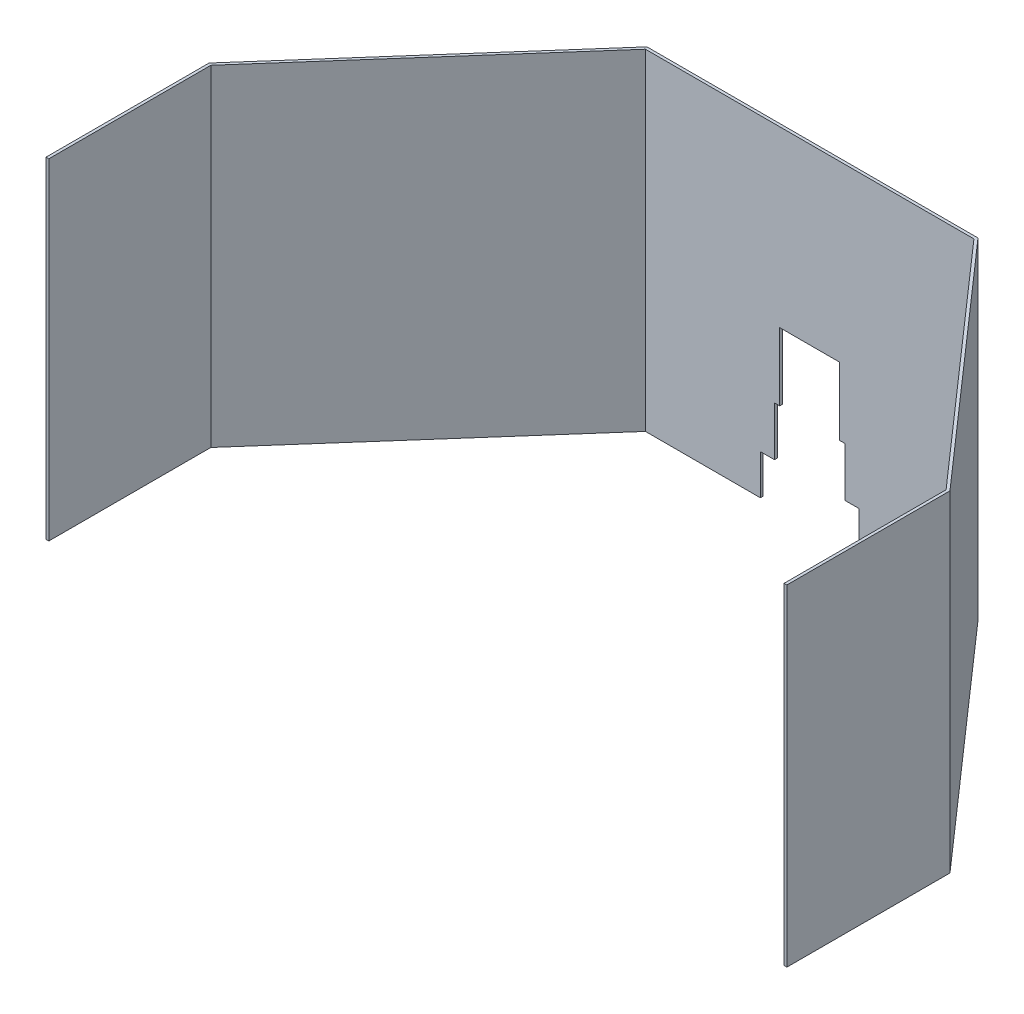
ISO-10303-21;
HEADER;
FILE_DESCRIPTION(('STEP AP214'),'2;1');
FILE_NAME('part.step','',(''),(''),'','','');
FILE_SCHEMA(('AUTOMOTIVE_DESIGN { 1 0 10303 214 1 1 1 1 }'));
ENDSEC;
DATA;
#1=APPLICATION_CONTEXT('core data for automotive mechanical design processes');
#2=APPLICATION_PROTOCOL_DEFINITION('international standard','automotive_design',2000,#1);
#3=PRODUCT_CONTEXT('',#1,'mechanical');
#4=PRODUCT('Part','Part','',(#3));
#5=PRODUCT_RELATED_PRODUCT_CATEGORY('part','',(#4));
#6=PRODUCT_DEFINITION_FORMATION('','',#4);
#7=PRODUCT_DEFINITION_CONTEXT('part definition',#1,'design');
#8=PRODUCT_DEFINITION('design','',#6,#7);
#9=PRODUCT_DEFINITION_SHAPE('','',#8);
#10=(LENGTH_UNIT() NAMED_UNIT(*) SI_UNIT(.MILLI.,.METRE.));
#11=(NAMED_UNIT(*) PLANE_ANGLE_UNIT() SI_UNIT($,.RADIAN.));
#12=(NAMED_UNIT(*) SI_UNIT($,.STERADIAN.) SOLID_ANGLE_UNIT());
#13=UNCERTAINTY_MEASURE_WITH_UNIT(LENGTH_MEASURE(1.E-05),#10,'distance_accuracy_value','');
#14=(GEOMETRIC_REPRESENTATION_CONTEXT(3) GLOBAL_UNCERTAINTY_ASSIGNED_CONTEXT((#13)) GLOBAL_UNIT_ASSIGNED_CONTEXT((#10,
#11,#12)) REPRESENTATION_CONTEXT('',''));
#15=CARTESIAN_POINT('',(0.,0.,0.));
#16=DIRECTION('',(0.,0.,1.));
#17=DIRECTION('',(1.,0.,0.));
#18=AXIS2_PLACEMENT_3D('',#15,#16,#17);
#19=CARTESIAN_POINT('',(0.,0.,0.));
#20=DIRECTION('',(0.,-1.,0.));
#21=DIRECTION('',(0.,0.,-1.));
#22=AXIS2_PLACEMENT_3D('',#19,#20,#21);
#23=PLANE('',#22);
#24=DIRECTION('',(1.,0.,0.));
#25=VECTOR('',#24,1.);
#26=CARTESIAN_POINT('',(-117.504462868261,0.,-326.155640462222));
#27=LINE('',#26,#25);
#28=CARTESIAN_POINT('',(-117.504462868261,0.,-326.155640462222));
#29=VERTEX_POINT('',#28);
#30=CARTESIAN_POINT('',(-35.0000000000001,0.,-326.155640462222));
#31=VERTEX_POINT('',#30);
#32=EDGE_CURVE('E179',#29,#31,#27,.T.);
#33=ORIENTED_EDGE('',*,*,#32,.T.);
#34=DIRECTION('',(0.,0.,-1.));
#35=VECTOR('',#34,1.);
#36=CARTESIAN_POINT('',(-35.,0.,-192.503637066453));
#37=LINE('',#36,#35);
#38=CARTESIAN_POINT('',(-35.0000000000001,0.,-324.155640398222));
#39=VERTEX_POINT('',#38);
#40=EDGE_CURVE('E261',#39,#31,#37,.T.);
#41=ORIENTED_EDGE('',*,*,#40,.F.);
#42=DIRECTION('',(1.,0.,0.));
#43=VECTOR('',#42,1.);
#44=CARTESIAN_POINT('',(-116.600094821892,0.,-324.155640398222));
#45=LINE('',#44,#43);
#46=CARTESIAN_POINT('',(-116.600094821892,0.,-324.155640398222));
#47=VERTEX_POINT('',#46);
#48=EDGE_CURVE('E192',#47,#39,#45,.T.);
#49=ORIENTED_EDGE('',*,*,#48,.F.);
#50=DIRECTION('',(-0.660480799666582,0.,0.750842935154745));
#51=VECTOR('',#50,1.);
#52=CARTESIAN_POINT('',(-116.600094821892,0.,-324.155640398222));
#53=LINE('',#52,#51);
#54=CARTESIAN_POINT('',(-261.,0.,-159.999999999999));
#55=VERTEX_POINT('',#54);
#56=EDGE_CURVE('E190',#47,#55,#53,.T.);
#57=ORIENTED_EDGE('',*,*,#56,.T.);
#58=DIRECTION('',(0.,0.,1.));
#59=VECTOR('',#58,1.);
#60=CARTESIAN_POINT('',(-261.,0.,-159.999999999999));
#61=LINE('',#60,#59);
#62=CARTESIAN_POINT('',(-261.,0.,-45.0012142751788));
#63=VERTEX_POINT('',#62);
#64=EDGE_CURVE('E145',#55,#63,#61,.T.);
#65=ORIENTED_EDGE('',*,*,#64,.T.);
#66=DIRECTION('',(1.,0.,9.02056178642204E-13));
#67=VECTOR('',#66,1.);
#68=CARTESIAN_POINT('',(-263.000000064,0.,-45.0012142751806));
#69=LINE('',#68,#67);
#70=CARTESIAN_POINT('',(-263.000000064,0.,-45.0012142751806));
#71=VERTEX_POINT('',#70);
#72=EDGE_CURVE('E186',#71,#63,#69,.T.);
#73=ORIENTED_EDGE('',*,*,#72,.F.);
#74=DIRECTION('',(0.,0.,1.));
#75=VECTOR('',#74,1.);
#76=CARTESIAN_POINT('',(-263.000000064,0.,-160.75447171498));
#77=LINE('',#76,#75);
#78=CARTESIAN_POINT('',(-263.000000064,0.,-160.75447171498));
#79=VERTEX_POINT('',#78);
#80=EDGE_CURVE('E184',#79,#71,#77,.T.);
#81=ORIENTED_EDGE('',*,*,#80,.F.);
#82=DIRECTION('',(-0.660480799666582,0.,0.750842935154745));
#83=VECTOR('',#82,1.);
#84=CARTESIAN_POINT('',(-117.504462868261,0.,-326.155640462222));
#85=LINE('',#84,#83);
#86=EDGE_CURVE('E182',#29,#79,#85,.T.);
#87=ORIENTED_EDGE('',*,*,#86,.F.);
#88=EDGE_LOOP('',(#33,#41,#49,#57,#65,#73,#81,#87));
#89=FACE_BOUND('',#88,.T.);
#90=ADVANCED_FACE('F33',(#89),#23,.T.);
#91=CARTESIAN_POINT('',(116.600094821898,234.9999999,-324.155640398222));
#92=DIRECTION('',(0.750842935154446,0.,-0.660480799666921));
#93=DIRECTION('',(-0.660480799666921,0.,-0.750842935154446));
#94=AXIS2_PLACEMENT_3D('',#91,#92,#93);
#95=PLANE('',#94);
#96=DIRECTION('',(0.660480799666921,0.,0.750842935154446));
#97=VECTOR('',#96,1.);
#98=CARTESIAN_POINT('',(116.600094821898,0.,-324.155640398222));
#99=LINE('',#98,#97);
#100=CARTESIAN_POINT('',(116.600094821898,0.,-324.155640398222));
#101=VERTEX_POINT('',#100);
#102=CARTESIAN_POINT('',(261.,0.,-160.000000000156));
#103=VERTEX_POINT('',#102);
#104=EDGE_CURVE('E165',#101,#103,#99,.T.);
#105=ORIENTED_EDGE('',*,*,#104,.T.);
#106=DIRECTION('',(0.,-1.,0.));
#107=VECTOR('',#106,1.);
#108=CARTESIAN_POINT('',(261.,234.9999999,-160.000000000156));
#109=LINE('',#108,#107);
#110=CARTESIAN_POINT('',(261.,234.9999999,-160.000000000156));
#111=VERTEX_POINT('',#110);
#112=EDGE_CURVE('E11',#111,#103,#109,.T.);
#113=ORIENTED_EDGE('',*,*,#112,.F.);
#114=DIRECTION('',(0.660480799666921,0.,0.750842935154446));
#115=VECTOR('',#114,1.);
#116=CARTESIAN_POINT('',(116.600094821898,234.9999999,-324.155640398222));
#117=LINE('',#116,#115);
#118=CARTESIAN_POINT('',(116.600094821898,234.9999999,-324.155640398222));
#119=VERTEX_POINT('',#118);
#120=EDGE_CURVE('E195',#119,#111,#117,.T.);
#121=ORIENTED_EDGE('',*,*,#120,.F.);
#122=DIRECTION('',(0.,-1.,0.));
#123=VECTOR('',#122,1.);
#124=CARTESIAN_POINT('',(116.600094821898,234.9999999,-324.155640398222));
#125=LINE('',#124,#123);
#126=EDGE_CURVE('E161',#119,#101,#125,.T.);
#127=ORIENTED_EDGE('',*,*,#126,.T.);
#128=EDGE_LOOP('',(#105,#113,#121,#127));
#129=FACE_BOUND('',#128,.T.);
#130=ADVANCED_FACE('F35',(#129),#95,.F.);
#131=CARTESIAN_POINT('',(261.,234.9999999,-160.000000000156));
#132=DIRECTION('',(1.,0.,0.));
#133=DIRECTION('',(0.,0.,-1.));
#134=AXIS2_PLACEMENT_3D('',#131,#132,#133);
#135=PLANE('',#134);
#136=DIRECTION('',(0.,0.,1.));
#137=VECTOR('',#136,1.);
#138=CARTESIAN_POINT('',(261.,0.,-160.000000000156));
#139=LINE('',#138,#137);
#140=CARTESIAN_POINT('',(261.,0.,-45.0034531183566));
#141=VERTEX_POINT('',#140);
#142=EDGE_CURVE('E168',#103,#141,#139,.T.);
#143=ORIENTED_EDGE('',*,*,#142,.T.);
#144=DIRECTION('',(0.,-1.,0.));
#145=VECTOR('',#144,1.);
#146=CARTESIAN_POINT('',(261.,234.9999999,-45.0034531183566));
#147=LINE('',#146,#145);
#148=CARTESIAN_POINT('',(261.,234.9999999,-45.0034531183566));
#149=VERTEX_POINT('',#148);
#150=EDGE_CURVE('E41',#149,#141,#147,.T.);
#151=ORIENTED_EDGE('',*,*,#150,.F.);
#152=DIRECTION('',(0.,0.,1.));
#153=VECTOR('',#152,1.);
#154=CARTESIAN_POINT('',(261.,234.9999999,-160.000000000156));
#155=LINE('',#154,#153);
#156=EDGE_CURVE('E111',#111,#149,#155,.T.);
#157=ORIENTED_EDGE('',*,*,#156,.F.);
#158=ORIENTED_EDGE('',*,*,#112,.T.);
#159=EDGE_LOOP('',(#143,#151,#157,#158));
#160=FACE_BOUND('',#159,.T.);
#161=ADVANCED_FACE('F477',(#160),#135,.F.);
#162=CARTESIAN_POINT('',(261.,234.9999999,-45.0034531183566));
#163=DIRECTION('',(0.,0.,-1.));
#164=DIRECTION('',(-1.,0.,0.));
#165=AXIS2_PLACEMENT_3D('',#162,#163,#164);
#166=PLANE('',#165);
#167=DIRECTION('',(1.,0.,0.));
#168=VECTOR('',#167,1.);
#169=CARTESIAN_POINT('',(261.,0.,-45.0034531183566));
#170=LINE('',#169,#168);
#171=CARTESIAN_POINT('',(263.000000064,0.,-45.0034531183566));
#172=VERTEX_POINT('',#171);
#173=EDGE_CURVE('E171',#141,#172,#170,.T.);
#174=ORIENTED_EDGE('',*,*,#173,.T.);
#175=DIRECTION('',(0.,-1.,0.));
#176=VECTOR('',#175,1.);
#177=CARTESIAN_POINT('',(263.000000064,234.9999999,-45.0034531183566));
#178=LINE('',#177,#176);
#179=CARTESIAN_POINT('',(263.000000064,234.9999999,-45.0034531183566));
#180=VERTEX_POINT('',#179);
#181=EDGE_CURVE('E213',#180,#172,#178,.T.);
#182=ORIENTED_EDGE('',*,*,#181,.F.);
#183=DIRECTION('',(1.,0.,0.));
#184=VECTOR('',#183,1.);
#185=CARTESIAN_POINT('',(261.,234.9999999,-45.0034531183566));
#186=LINE('',#185,#184);
#187=EDGE_CURVE('E221',#149,#180,#186,.T.);
#188=ORIENTED_EDGE('',*,*,#187,.F.);
#189=ORIENTED_EDGE('',*,*,#150,.T.);
#190=EDGE_LOOP('',(#174,#182,#188,#189));
#191=FACE_BOUND('',#190,.T.);
#192=ADVANCED_FACE('F219',(#191),#166,.F.);
#193=CARTESIAN_POINT('',(263.000000064,234.9999999,-45.0034531183566));
#194=DIRECTION('',(-1.,0.,0.));
#195=DIRECTION('',(0.,0.,1.));
#196=AXIS2_PLACEMENT_3D('',#193,#194,#195);
#197=PLANE('',#196);
#198=DIRECTION('',(0.,0.,-1.));
#199=VECTOR('',#198,1.);
#200=CARTESIAN_POINT('',(263.000000064,0.,-45.0034531183566));
#201=LINE('',#200,#199);
#202=CARTESIAN_POINT('',(263.000000064,0.,-160.754471714977));
#203=VERTEX_POINT('',#202);
#204=EDGE_CURVE('E173',#172,#203,#201,.T.);
#205=ORIENTED_EDGE('',*,*,#204,.T.);
#206=DIRECTION('',(0.,-1.,0.));
#207=VECTOR('',#206,1.);
#208=CARTESIAN_POINT('',(263.000000064,234.9999999,-160.754471714977));
#209=LINE('',#208,#207);
#210=CARTESIAN_POINT('',(263.000000064,234.9999999,-160.754471714977));
#211=VERTEX_POINT('',#210);
#212=EDGE_CURVE('E210',#211,#203,#209,.T.);
#213=ORIENTED_EDGE('',*,*,#212,.F.);
#214=DIRECTION('',(0.,0.,-1.));
#215=VECTOR('',#214,1.);
#216=CARTESIAN_POINT('',(263.000000064,234.9999999,-45.0034531183566));
#217=LINE('',#216,#215);
#218=EDGE_CURVE('E240',#180,#211,#217,.T.);
#219=ORIENTED_EDGE('',*,*,#218,.F.);
#220=ORIENTED_EDGE('',*,*,#181,.T.);
#221=EDGE_LOOP('',(#205,#213,#219,#220));
#222=FACE_BOUND('',#221,.T.);
#223=ADVANCED_FACE('F230',(#222),#197,.F.);
#224=CARTESIAN_POINT('',(263.000000064,234.9999999,-160.754471714977));
#225=DIRECTION('',(-0.750842935154767,0.,0.660480799666557));
#226=DIRECTION('',(0.660480799666557,0.,0.750842935154767));
#227=AXIS2_PLACEMENT_3D('',#224,#225,#226);
#228=PLANE('',#227);
#229=DIRECTION('',(-0.660480799666557,0.,-0.750842935154767));
#230=VECTOR('',#229,1.);
#231=CARTESIAN_POINT('',(263.000000064,0.,-160.754471714977));
#232=LINE('',#231,#230);
#233=CARTESIAN_POINT('',(117.504462868267,0.,-326.155640462222));
#234=VERTEX_POINT('',#233);
#235=EDGE_CURVE('E175',#203,#234,#232,.T.);
#236=ORIENTED_EDGE('',*,*,#235,.T.);
#237=DIRECTION('',(0.,-1.,0.));
#238=VECTOR('',#237,1.);
#239=CARTESIAN_POINT('',(117.504462868267,234.9999999,-326.155640462222));
#240=LINE('',#239,#238);
#241=CARTESIAN_POINT('',(117.504462868267,234.9999999,-326.155640462222));
#242=VERTEX_POINT('',#241);
#243=EDGE_CURVE('E207',#242,#234,#240,.T.);
#244=ORIENTED_EDGE('',*,*,#243,.F.);
#245=DIRECTION('',(-0.660480799666557,0.,-0.750842935154767));
#246=VECTOR('',#245,1.);
#247=CARTESIAN_POINT('',(263.000000064,234.9999999,-160.754471714977));
#248=LINE('',#247,#246);
#249=EDGE_CURVE('E236',#211,#242,#248,.T.);
#250=ORIENTED_EDGE('',*,*,#249,.F.);
#251=ORIENTED_EDGE('',*,*,#212,.T.);
#252=EDGE_LOOP('',(#236,#244,#250,#251));
#253=FACE_BOUND('',#252,.T.);
#254=ADVANCED_FACE('F234',(#253),#228,.F.);
#255=CARTESIAN_POINT('',(-117.504462868261,234.9999999,-326.155640462222));
#256=DIRECTION('',(0.,0.,-1.));
#257=DIRECTION('',(-1.,0.,0.));
#258=AXIS2_PLACEMENT_3D('',#255,#256,#257);
#259=PLANE('',#258);
#260=DIRECTION('',(0.,-1.,0.));
#261=VECTOR('',#260,1.);
#262=CARTESIAN_POINT('',(35.,0.,-326.155640462222));
#263=LINE('',#262,#261);
#264=CARTESIAN_POINT('',(35.,28.4,-326.155640462222));
#265=VERTEX_POINT('',#264);
#266=CARTESIAN_POINT('',(35.,0.,-326.155640462222));
#267=VERTEX_POINT('',#266);
#268=EDGE_CURVE('E317',#265,#267,#263,.T.);
#269=ORIENTED_EDGE('',*,*,#268,.F.);
#270=DIRECTION('',(-1.,0.,0.));
#271=VECTOR('',#270,1.);
#272=CARTESIAN_POINT('',(0.,28.4,-326.155640462222));
#273=LINE('',#272,#271);
#274=CARTESIAN_POINT('',(24.9999999999999,28.4,-326.155640462222));
#275=VERTEX_POINT('',#274);
#276=EDGE_CURVE('E320',#265,#275,#273,.T.);
#277=ORIENTED_EDGE('',*,*,#276,.T.);
#278=DIRECTION('',(0.,-1.,0.));
#279=VECTOR('',#278,1.);
#280=CARTESIAN_POINT('',(24.9999999999999,0.,-326.155640462222));
#281=LINE('',#280,#279);
#282=CARTESIAN_POINT('',(24.9999999999999,63.399999946,-326.155640462222));
#283=VERTEX_POINT('',#282);
#284=EDGE_CURVE('E323',#283,#275,#281,.T.);
#285=ORIENTED_EDGE('',*,*,#284,.F.);
#286=DIRECTION('',(-1.,0.,0.));
#287=VECTOR('',#286,1.);
#288=CARTESIAN_POINT('',(0.,63.399999946,-326.155640462222));
#289=LINE('',#288,#287);
#290=CARTESIAN_POINT('',(21.2499999999999,63.399999946,-326.155640462222));
#291=VERTEX_POINT('',#290);
#292=EDGE_CURVE('E326',#283,#291,#289,.T.);
#293=ORIENTED_EDGE('',*,*,#292,.T.);
#294=DIRECTION('',(0.,-1.,0.));
#295=VECTOR('',#294,1.);
#296=CARTESIAN_POINT('',(21.2499999999999,0.,-326.155640462222));
#297=LINE('',#296,#295);
#298=CARTESIAN_POINT('',(21.2499999999999,111.499999916,-326.155640462222));
#299=VERTEX_POINT('',#298);
#300=EDGE_CURVE('E329',#299,#291,#297,.T.);
#301=ORIENTED_EDGE('',*,*,#300,.F.);
#302=DIRECTION('',(-1.,0.,0.));
#303=VECTOR('',#302,1.);
#304=CARTESIAN_POINT('',(-1.0640890797438E-13,111.499999916,-326.155640462222));
#305=LINE('',#304,#303);
#306=CARTESIAN_POINT('',(-21.2500000000001,111.499999916,-326.155640462222));
#307=VERTEX_POINT('',#306);
#308=EDGE_CURVE('E332',#299,#307,#305,.T.);
#309=ORIENTED_EDGE('',*,*,#308,.T.);
#310=DIRECTION('',(0.,-1.,0.));
#311=VECTOR('',#310,1.);
#312=CARTESIAN_POINT('',(-21.2500000000001,0.,-326.155640462222));
#313=LINE('',#312,#311);
#314=CARTESIAN_POINT('',(-21.2500000000001,63.399999946,-326.155640462222));
#315=VERTEX_POINT('',#314);
#316=EDGE_CURVE('E335',#307,#315,#313,.T.);
#317=ORIENTED_EDGE('',*,*,#316,.T.);
#318=CARTESIAN_POINT('',(-25.0000000000001,63.399999946,-326.155640462222));
#319=VERTEX_POINT('',#318);
#320=EDGE_CURVE('E281',#315,#319,#289,.T.);
#321=ORIENTED_EDGE('',*,*,#320,.T.);
#322=DIRECTION('',(0.,-1.,0.));
#323=VECTOR('',#322,1.);
#324=CARTESIAN_POINT('',(-25.0000000000001,0.,-326.155640462222));
#325=LINE('',#324,#323);
#326=CARTESIAN_POINT('',(-25.0000000000001,28.4,-326.155640462222));
#327=VERTEX_POINT('',#326);
#328=EDGE_CURVE('E310',#319,#327,#325,.T.);
#329=ORIENTED_EDGE('',*,*,#328,.T.);
#330=CARTESIAN_POINT('',(-35.,28.4,-326.155640462222));
#331=VERTEX_POINT('',#330);
#332=EDGE_CURVE('E313',#327,#331,#273,.T.);
#333=ORIENTED_EDGE('',*,*,#332,.T.);
#334=DIRECTION('',(0.,-1.,0.));
#335=VECTOR('',#334,1.);
#336=CARTESIAN_POINT('',(-35.0000000000001,0.,-326.155640462222));
#337=LINE('',#336,#335);
#338=EDGE_CURVE('E314',#331,#31,#337,.T.);
#339=ORIENTED_EDGE('',*,*,#338,.T.);
#340=ORIENTED_EDGE('',*,*,#32,.F.);
#341=DIRECTION('',(0.,-1.,0.));
#342=VECTOR('',#341,1.);
#343=CARTESIAN_POINT('',(-117.504462868261,234.9999999,-326.155640462222));
#344=LINE('',#343,#342);
#345=CARTESIAN_POINT('',(-117.504462868261,234.9999999,-326.155640462222));
#346=VERTEX_POINT('',#345);
#347=EDGE_CURVE('E205',#346,#29,#344,.T.);
#348=ORIENTED_EDGE('',*,*,#347,.F.);
#349=DIRECTION('',(1.,0.,0.));
#350=VECTOR('',#349,1.);
#351=CARTESIAN_POINT('',(-117.504462868261,234.9999999,-326.155640462222));
#352=LINE('',#351,#350);
#353=EDGE_CURVE('E239',#346,#242,#352,.T.);
#354=ORIENTED_EDGE('',*,*,#353,.T.);
#355=ORIENTED_EDGE('',*,*,#243,.T.);
#356=EDGE_CURVE('E178',#267,#234,#27,.T.);
#357=ORIENTED_EDGE('',*,*,#356,.F.);
#358=EDGE_LOOP('',(#269,#277,#285,#293,#301,#309,#317,#321,#329,#333,#339,#340,#348,#354,#355,#357));
#359=FACE_BOUND('',#358,.T.);
#360=ADVANCED_FACE('F397',(#359),#259,.T.);
#361=CARTESIAN_POINT('',(-117.504462868261,234.9999999,-326.155640462222));
#362=DIRECTION('',(0.750842935154745,0.,0.660480799666582));
#363=DIRECTION('',(0.660480799666582,0.,-0.750842935154745));
#364=AXIS2_PLACEMENT_3D('',#361,#362,#363);
#365=PLANE('',#364);
#366=ORIENTED_EDGE('',*,*,#86,.T.);
#367=DIRECTION('',(0.,-1.,0.));
#368=VECTOR('',#367,1.);
#369=CARTESIAN_POINT('',(-263.000000064,234.9999999,-160.75447171498));
#370=LINE('',#369,#368);
#371=CARTESIAN_POINT('',(-263.000000064,234.9999999,-160.75447171498));
#372=VERTEX_POINT('',#371);
#373=EDGE_CURVE('E202',#372,#79,#370,.T.);
#374=ORIENTED_EDGE('',*,*,#373,.F.);
#375=DIRECTION('',(-0.660480799666582,0.,0.750842935154745));
#376=VECTOR('',#375,1.);
#377=CARTESIAN_POINT('',(-117.504462868261,234.9999999,-326.155640462222));
#378=LINE('',#377,#376);
#379=EDGE_CURVE('E242',#346,#372,#378,.T.);
#380=ORIENTED_EDGE('',*,*,#379,.F.);
#381=ORIENTED_EDGE('',*,*,#347,.T.);
#382=EDGE_LOOP('',(#366,#374,#380,#381));
#383=FACE_BOUND('',#382,.T.);
#384=ADVANCED_FACE('F445',(#383),#365,.F.);
#385=CARTESIAN_POINT('',(-263.000000064,234.9999999,-160.75447171498));
#386=DIRECTION('',(1.,0.,0.));
#387=DIRECTION('',(0.,0.,-1.));
#388=AXIS2_PLACEMENT_3D('',#385,#386,#387);
#389=PLANE('',#388);
#390=ORIENTED_EDGE('',*,*,#80,.T.);
#391=DIRECTION('',(0.,-1.,0.));
#392=VECTOR('',#391,1.);
#393=CARTESIAN_POINT('',(-263.000000064,234.9999999,-45.0012142751806));
#394=LINE('',#393,#392);
#395=CARTESIAN_POINT('',(-263.000000064,234.9999999,-45.0012142751806));
#396=VERTEX_POINT('',#395);
#397=EDGE_CURVE('E199',#396,#71,#394,.T.);
#398=ORIENTED_EDGE('',*,*,#397,.F.);
#399=DIRECTION('',(0.,0.,1.));
#400=VECTOR('',#399,1.);
#401=CARTESIAN_POINT('',(-263.000000064,234.9999999,-160.75447171498));
#402=LINE('',#401,#400);
#403=EDGE_CURVE('E248',#372,#396,#402,.T.);
#404=ORIENTED_EDGE('',*,*,#403,.F.);
#405=ORIENTED_EDGE('',*,*,#373,.T.);
#406=EDGE_LOOP('',(#390,#398,#404,#405));
#407=FACE_BOUND('',#406,.T.);
#408=ADVANCED_FACE('F254',(#407),#389,.F.);
#409=CARTESIAN_POINT('',(-263.000000064,234.9999999,-45.0012142751806));
#410=DIRECTION('',(9.02056178642204E-13,0.,-1.));
#411=DIRECTION('',(-1.,0.,-9.02056178642204E-13));
#412=AXIS2_PLACEMENT_3D('',#409,#410,#411);
#413=PLANE('',#412);
#414=ORIENTED_EDGE('',*,*,#72,.T.);
#415=DIRECTION('',(0.,-1.,0.));
#416=VECTOR('',#415,1.);
#417=CARTESIAN_POINT('',(-261.,234.9999999,-45.0012142751788));
#418=LINE('',#417,#416);
#419=CARTESIAN_POINT('',(-261.,234.9999999,-45.0012142751788));
#420=VERTEX_POINT('',#419);
#421=EDGE_CURVE('E150',#420,#63,#418,.T.);
#422=ORIENTED_EDGE('',*,*,#421,.F.);
#423=DIRECTION('',(1.,0.,9.02056178642204E-13));
#424=VECTOR('',#423,1.);
#425=CARTESIAN_POINT('',(-263.000000064,234.9999999,-45.0012142751806));
#426=LINE('',#425,#424);
#427=EDGE_CURVE('E156',#396,#420,#426,.T.);
#428=ORIENTED_EDGE('',*,*,#427,.F.);
#429=ORIENTED_EDGE('',*,*,#397,.T.);
#430=EDGE_LOOP('',(#414,#422,#428,#429));
#431=FACE_BOUND('',#430,.T.);
#432=ADVANCED_FACE('F258',(#431),#413,.F.);
#433=CARTESIAN_POINT('',(-261.,234.9999999,-159.999999999999));
#434=DIRECTION('',(1.,0.,0.));
#435=DIRECTION('',(0.,0.,-1.));
#436=AXIS2_PLACEMENT_3D('',#433,#434,#435);
#437=PLANE('',#436);
#438=ORIENTED_EDGE('',*,*,#64,.F.);
#439=DIRECTION('',(0.,-1.,0.));
#440=VECTOR('',#439,1.);
#441=CARTESIAN_POINT('',(-261.,234.9999999,-159.999999999999));
#442=LINE('',#441,#440);
#443=CARTESIAN_POINT('',(-261.,234.9999999,-159.999999999999));
#444=VERTEX_POINT('',#443);
#445=EDGE_CURVE('E140',#444,#55,#442,.T.);
#446=ORIENTED_EDGE('',*,*,#445,.F.);
#447=DIRECTION('',(0.,0.,1.));
#448=VECTOR('',#447,1.);
#449=CARTESIAN_POINT('',(-261.,234.9999999,-159.999999999999));
#450=LINE('',#449,#448);
#451=EDGE_CURVE('E143',#444,#420,#450,.T.);
#452=ORIENTED_EDGE('',*,*,#451,.T.);
#453=ORIENTED_EDGE('',*,*,#421,.T.);
#454=EDGE_LOOP('',(#438,#446,#452,#453));
#455=FACE_BOUND('',#454,.T.);
#456=ADVANCED_FACE('F142',(#455),#437,.T.);
#457=CARTESIAN_POINT('',(-116.600094821892,234.9999999,-324.155640398222));
#458=DIRECTION('',(0.750842935154745,0.,0.660480799666582));
#459=DIRECTION('',(0.660480799666582,0.,-0.750842935154745));
#460=AXIS2_PLACEMENT_3D('',#457,#458,#459);
#461=PLANE('',#460);
#462=ORIENTED_EDGE('',*,*,#56,.F.);
#463=DIRECTION('',(0.,-1.,0.));
#464=VECTOR('',#463,1.);
#465=CARTESIAN_POINT('',(-116.600094821892,234.9999999,-324.155640398222));
#466=LINE('',#465,#464);
#467=CARTESIAN_POINT('',(-116.600094821892,234.9999999,-324.155640398222));
#468=VERTEX_POINT('',#467);
#469=EDGE_CURVE('E151',#468,#47,#466,.T.);
#470=ORIENTED_EDGE('',*,*,#469,.F.);
#471=DIRECTION('',(-0.660480799666582,0.,0.750842935154745));
#472=VECTOR('',#471,1.);
#473=CARTESIAN_POINT('',(-116.600094821892,234.9999999,-324.155640398222));
#474=LINE('',#473,#472);
#475=EDGE_CURVE('E154',#468,#444,#474,.T.);
#476=ORIENTED_EDGE('',*,*,#475,.T.);
#477=ORIENTED_EDGE('',*,*,#445,.T.);
#478=EDGE_LOOP('',(#462,#470,#476,#477));
#479=FACE_BOUND('',#478,.T.);
#480=ADVANCED_FACE('F159',(#479),#461,.T.);
#481=CARTESIAN_POINT('',(-116.600094821892,234.9999999,-324.155640398222));
#482=DIRECTION('',(0.,0.,-1.));
#483=DIRECTION('',(-1.,0.,0.));
#484=AXIS2_PLACEMENT_3D('',#481,#482,#483);
#485=PLANE('',#484);
#486=DIRECTION('',(1.,0.,0.));
#487=VECTOR('',#486,1.);
#488=CARTESIAN_POINT('',(0.,28.4,-324.155640398222));
#489=LINE('',#488,#487);
#490=CARTESIAN_POINT('',(24.9999999999999,28.4,-324.155640398222));
#491=VERTEX_POINT('',#490);
#492=CARTESIAN_POINT('',(35.,28.4,-324.155640398222));
#493=VERTEX_POINT('',#492);
#494=EDGE_CURVE('E352',#491,#493,#489,.T.);
#495=ORIENTED_EDGE('',*,*,#494,.T.);
#496=DIRECTION('',(0.,1.,0.));
#497=VECTOR('',#496,1.);
#498=CARTESIAN_POINT('',(35.,0.,-324.155640398222));
#499=LINE('',#498,#497);
#500=CARTESIAN_POINT('',(35.,0.,-324.155640398222));
#501=VERTEX_POINT('',#500);
#502=EDGE_CURVE('E349',#501,#493,#499,.T.);
#503=ORIENTED_EDGE('',*,*,#502,.F.);
#504=EDGE_CURVE('E103',#501,#101,#45,.T.);
#505=ORIENTED_EDGE('',*,*,#504,.T.);
#506=ORIENTED_EDGE('',*,*,#126,.F.);
#507=DIRECTION('',(1.,0.,0.));
#508=VECTOR('',#507,1.);
#509=CARTESIAN_POINT('',(-116.600094821892,234.9999999,-324.155640398222));
#510=LINE('',#509,#508);
#511=EDGE_CURVE('E57',#468,#119,#510,.T.);
#512=ORIENTED_EDGE('',*,*,#511,.F.);
#513=ORIENTED_EDGE('',*,*,#469,.T.);
#514=ORIENTED_EDGE('',*,*,#48,.T.);
#515=DIRECTION('',(0.,1.,0.));
#516=VECTOR('',#515,1.);
#517=CARTESIAN_POINT('',(-35.,0.,-324.155640398222));
#518=LINE('',#517,#516);
#519=CARTESIAN_POINT('',(-35.,28.4,-324.155640398222));
#520=VERTEX_POINT('',#519);
#521=EDGE_CURVE('E48',#39,#520,#518,.T.);
#522=ORIENTED_EDGE('',*,*,#521,.T.);
#523=DIRECTION('',(1.,0.,0.));
#524=VECTOR('',#523,1.);
#525=CARTESIAN_POINT('',(0.,28.4,-324.155640398222));
#526=LINE('',#525,#524);
#527=CARTESIAN_POINT('',(-25.0000000000001,28.4,-324.155640398222));
#528=VERTEX_POINT('',#527);
#529=EDGE_CURVE('E346',#520,#528,#526,.T.);
#530=ORIENTED_EDGE('',*,*,#529,.T.);
#531=DIRECTION('',(0.,1.,0.));
#532=VECTOR('',#531,1.);
#533=CARTESIAN_POINT('',(-25.0000000000001,0.,-324.155640398222));
#534=LINE('',#533,#532);
#535=CARTESIAN_POINT('',(-25.0000000000001,63.399999946,-324.155640398222));
#536=VERTEX_POINT('',#535);
#537=EDGE_CURVE('E343',#528,#536,#534,.T.);
#538=ORIENTED_EDGE('',*,*,#537,.T.);
#539=DIRECTION('',(1.,0.,0.));
#540=VECTOR('',#539,1.);
#541=CARTESIAN_POINT('',(0.,63.399999946,-324.155640398222));
#542=LINE('',#541,#540);
#543=CARTESIAN_POINT('',(-21.25,63.399999946,-324.155640398222));
#544=VERTEX_POINT('',#543);
#545=EDGE_CURVE('E340',#536,#544,#542,.T.);
#546=ORIENTED_EDGE('',*,*,#545,.T.);
#547=DIRECTION('',(0.,1.,0.));
#548=VECTOR('',#547,1.);
#549=CARTESIAN_POINT('',(-21.2500000000001,0.,-324.155640398222));
#550=LINE('',#549,#548);
#551=CARTESIAN_POINT('',(-21.2500000000001,111.499999916,-324.155640398222));
#552=VERTEX_POINT('',#551);
#553=EDGE_CURVE('E169',#544,#552,#550,.T.);
#554=ORIENTED_EDGE('',*,*,#553,.T.);
#555=DIRECTION('',(1.,0.,0.));
#556=VECTOR('',#555,1.);
#557=CARTESIAN_POINT('',(0.,111.499999916,-324.155640398222));
#558=LINE('',#557,#556);
#559=CARTESIAN_POINT('',(21.2499999999999,111.499999916,-324.155640398222));
#560=VERTEX_POINT('',#559);
#561=EDGE_CURVE('E272',#552,#560,#558,.T.);
#562=ORIENTED_EDGE('',*,*,#561,.T.);
#563=DIRECTION('',(0.,1.,0.));
#564=VECTOR('',#563,1.);
#565=CARTESIAN_POINT('',(21.2499999999999,0.,-324.155640398222));
#566=LINE('',#565,#564);
#567=CARTESIAN_POINT('',(21.2499999999999,63.399999946,-324.155640398222));
#568=VERTEX_POINT('',#567);
#569=EDGE_CURVE('E275',#568,#560,#566,.T.);
#570=ORIENTED_EDGE('',*,*,#569,.F.);
#571=DIRECTION('',(1.,0.,0.));
#572=VECTOR('',#571,1.);
#573=CARTESIAN_POINT('',(0.,63.399999946,-324.155640398222));
#574=LINE('',#573,#572);
#575=CARTESIAN_POINT('',(25.,63.399999946,-324.155640398222));
#576=VERTEX_POINT('',#575);
#577=EDGE_CURVE('E357',#568,#576,#574,.T.);
#578=ORIENTED_EDGE('',*,*,#577,.T.);
#579=DIRECTION('',(0.,1.,0.));
#580=VECTOR('',#579,1.);
#581=CARTESIAN_POINT('',(24.9999999999999,0.,-324.155640398222));
#582=LINE('',#581,#580);
#583=EDGE_CURVE('E354',#491,#576,#582,.T.);
#584=ORIENTED_EDGE('',*,*,#583,.F.);
#585=EDGE_LOOP('',(#495,#503,#505,#506,#512,#513,#514,#522,#530,#538,#546,#554,#562,#570,#578,#584));
#586=FACE_BOUND('',#585,.T.);
#587=ADVANCED_FACE('F263',(#586),#485,.F.);
#588=CARTESIAN_POINT('',(0.,234.9999999,0.));
#589=DIRECTION('',(0.,-1.,0.));
#590=DIRECTION('',(0.,0.,-1.));
#591=AXIS2_PLACEMENT_3D('',#588,#589,#590);
#592=PLANE('',#591);
#593=ORIENTED_EDGE('',*,*,#120,.T.);
#594=ORIENTED_EDGE('',*,*,#156,.T.);
#595=ORIENTED_EDGE('',*,*,#187,.T.);
#596=ORIENTED_EDGE('',*,*,#218,.T.);
#597=ORIENTED_EDGE('',*,*,#249,.T.);
#598=ORIENTED_EDGE('',*,*,#353,.F.);
#599=ORIENTED_EDGE('',*,*,#379,.T.);
#600=ORIENTED_EDGE('',*,*,#403,.T.);
#601=ORIENTED_EDGE('',*,*,#427,.T.);
#602=ORIENTED_EDGE('',*,*,#451,.F.);
#603=ORIENTED_EDGE('',*,*,#475,.F.);
#604=ORIENTED_EDGE('',*,*,#511,.T.);
#605=EDGE_LOOP('',(#593,#594,#595,#596,#597,#598,#599,#600,#601,#602,#603,#604));
#606=FACE_BOUND('',#605,.T.);
#607=ADVANCED_FACE('F153',(#606),#592,.F.);
#608=DIRECTION('',(0.,0.,-1.));
#609=VECTOR('',#608,1.);
#610=CARTESIAN_POINT('',(35.,0.,-192.503637066453));
#611=LINE('',#610,#609);
#612=EDGE_CURVE('E296',#501,#267,#611,.T.);
#613=ORIENTED_EDGE('',*,*,#612,.T.);
#614=ORIENTED_EDGE('',*,*,#356,.T.);
#615=ORIENTED_EDGE('',*,*,#235,.F.);
#616=ORIENTED_EDGE('',*,*,#204,.F.);
#617=ORIENTED_EDGE('',*,*,#173,.F.);
#618=ORIENTED_EDGE('',*,*,#142,.F.);
#619=ORIENTED_EDGE('',*,*,#104,.F.);
#620=ORIENTED_EDGE('',*,*,#504,.F.);
#621=EDGE_LOOP('',(#613,#614,#615,#616,#617,#618,#619,#620));
#622=FACE_BOUND('',#621,.T.);
#623=ADVANCED_FACE('F225',(#622),#23,.T.);
#624=CARTESIAN_POINT('',(0.,111.499999916,-192.503637066453));
#625=DIRECTION('',(0.,-1.,0.));
#626=DIRECTION('',(1.,0.,0.));
#627=AXIS2_PLACEMENT_3D('',#624,#625,#626);
#628=PLANE('',#627);
#629=DIRECTION('',(0.,0.,-1.));
#630=VECTOR('',#629,1.);
#631=CARTESIAN_POINT('',(-21.25,111.499999916,-192.503637066453));
#632=LINE('',#631,#630);
#633=EDGE_CURVE('E277',#552,#307,#632,.T.);
#634=ORIENTED_EDGE('',*,*,#633,.T.);
#635=ORIENTED_EDGE('',*,*,#308,.F.);
#636=DIRECTION('',(0.,0.,-1.));
#637=VECTOR('',#636,1.);
#638=CARTESIAN_POINT('',(21.25,111.499999916,-192.503637066453));
#639=LINE('',#638,#637);
#640=EDGE_CURVE('E280',#560,#299,#639,.T.);
#641=ORIENTED_EDGE('',*,*,#640,.F.);
#642=ORIENTED_EDGE('',*,*,#561,.F.);
#643=EDGE_LOOP('',(#634,#635,#641,#642));
#644=FACE_BOUND('',#643,.T.);
#645=ADVANCED_FACE('F375',(#644),#628,.T.);
#646=CARTESIAN_POINT('',(21.2499999999999,0.,-192.503637066453));
#647=DIRECTION('',(1.,0.,0.));
#648=DIRECTION('',(0.,1.,0.));
#649=AXIS2_PLACEMENT_3D('',#646,#647,#648);
#650=PLANE('',#649);
#651=ORIENTED_EDGE('',*,*,#569,.T.);
#652=ORIENTED_EDGE('',*,*,#640,.T.);
#653=ORIENTED_EDGE('',*,*,#300,.T.);
#654=DIRECTION('',(0.,0.,-1.));
#655=VECTOR('',#654,1.);
#656=CARTESIAN_POINT('',(21.25,63.399999946,-192.503637066453));
#657=LINE('',#656,#655);
#658=EDGE_CURVE('E284',#568,#291,#657,.T.);
#659=ORIENTED_EDGE('',*,*,#658,.F.);
#660=EDGE_LOOP('',(#651,#652,#653,#659));
#661=FACE_BOUND('',#660,.T.);
#662=ADVANCED_FACE('F366',(#661),#650,.F.);
#663=CARTESIAN_POINT('',(0.,63.399999946,-192.503637066453));
#664=DIRECTION('',(0.,-1.,0.));
#665=DIRECTION('',(0.,0.,-1.));
#666=AXIS2_PLACEMENT_3D('',#663,#664,#665);
#667=PLANE('',#666);
#668=ORIENTED_EDGE('',*,*,#658,.T.);
#669=ORIENTED_EDGE('',*,*,#292,.F.);
#670=DIRECTION('',(0.,0.,-1.));
#671=VECTOR('',#670,1.);
#672=CARTESIAN_POINT('',(25.,63.399999946,-192.503637066453));
#673=LINE('',#672,#671);
#674=EDGE_CURVE('E287',#576,#283,#673,.T.);
#675=ORIENTED_EDGE('',*,*,#674,.F.);
#676=ORIENTED_EDGE('',*,*,#577,.F.);
#677=EDGE_LOOP('',(#668,#669,#675,#676));
#678=FACE_BOUND('',#677,.T.);
#679=ADVANCED_FACE('F461',(#678),#667,.T.);
#680=CARTESIAN_POINT('',(24.9999999999999,0.,-192.503637066453));
#681=DIRECTION('',(1.,0.,0.));
#682=DIRECTION('',(0.,1.,0.));
#683=AXIS2_PLACEMENT_3D('',#680,#681,#682);
#684=PLANE('',#683);
#685=ORIENTED_EDGE('',*,*,#583,.T.);
#686=ORIENTED_EDGE('',*,*,#674,.T.);
#687=ORIENTED_EDGE('',*,*,#284,.T.);
#688=DIRECTION('',(0.,0.,-1.));
#689=VECTOR('',#688,1.);
#690=CARTESIAN_POINT('',(25.,28.4,-192.503637066453));
#691=LINE('',#690,#689);
#692=EDGE_CURVE('E290',#491,#275,#691,.T.);
#693=ORIENTED_EDGE('',*,*,#692,.F.);
#694=EDGE_LOOP('',(#685,#686,#687,#693));
#695=FACE_BOUND('',#694,.T.);
#696=ADVANCED_FACE('F456',(#695),#684,.F.);
#697=CARTESIAN_POINT('',(0.,28.4,-192.503637066453));
#698=DIRECTION('',(0.,-1.,0.));
#699=DIRECTION('',(0.,0.,-1.));
#700=AXIS2_PLACEMENT_3D('',#697,#698,#699);
#701=PLANE('',#700);
#702=ORIENTED_EDGE('',*,*,#692,.T.);
#703=ORIENTED_EDGE('',*,*,#276,.F.);
#704=DIRECTION('',(0.,0.,-1.));
#705=VECTOR('',#704,1.);
#706=CARTESIAN_POINT('',(35.,28.4,-192.503637066453));
#707=LINE('',#706,#705);
#708=EDGE_CURVE('E293',#493,#265,#707,.T.);
#709=ORIENTED_EDGE('',*,*,#708,.F.);
#710=ORIENTED_EDGE('',*,*,#494,.F.);
#711=EDGE_LOOP('',(#702,#703,#709,#710));
#712=FACE_BOUND('',#711,.T.);
#713=ADVANCED_FACE('F453',(#712),#701,.T.);
#714=CARTESIAN_POINT('',(35.,0.,-192.503637066453));
#715=DIRECTION('',(1.,0.,0.));
#716=DIRECTION('',(0.,1.,0.));
#717=AXIS2_PLACEMENT_3D('',#714,#715,#716);
#718=PLANE('',#717);
#719=ORIENTED_EDGE('',*,*,#502,.T.);
#720=ORIENTED_EDGE('',*,*,#708,.T.);
#721=ORIENTED_EDGE('',*,*,#268,.T.);
#722=ORIENTED_EDGE('',*,*,#612,.F.);
#723=EDGE_LOOP('',(#719,#720,#721,#722));
#724=FACE_BOUND('',#723,.T.);
#725=ADVANCED_FACE('F448',(#724),#718,.F.);
#726=CARTESIAN_POINT('',(-35.,0.,-192.503637066453));
#727=DIRECTION('',(1.,0.,0.));
#728=DIRECTION('',(0.,1.,0.));
#729=AXIS2_PLACEMENT_3D('',#726,#727,#728);
#730=PLANE('',#729);
#731=ORIENTED_EDGE('',*,*,#40,.T.);
#732=ORIENTED_EDGE('',*,*,#338,.F.);
#733=DIRECTION('',(0.,0.,-1.));
#734=VECTOR('',#733,1.);
#735=CARTESIAN_POINT('',(-35.,28.4,-192.503637066453));
#736=LINE('',#735,#734);
#737=EDGE_CURVE('E299',#520,#331,#736,.T.);
#738=ORIENTED_EDGE('',*,*,#737,.F.);
#739=ORIENTED_EDGE('',*,*,#521,.F.);
#740=EDGE_LOOP('',(#731,#732,#738,#739));
#741=FACE_BOUND('',#740,.T.);
#742=ADVANCED_FACE('F494',(#741),#730,.T.);
#743=ORIENTED_EDGE('',*,*,#737,.T.);
#744=ORIENTED_EDGE('',*,*,#332,.F.);
#745=DIRECTION('',(0.,0.,-1.));
#746=VECTOR('',#745,1.);
#747=CARTESIAN_POINT('',(-25.0000000000001,28.4,-192.503637066453));
#748=LINE('',#747,#746);
#749=EDGE_CURVE('E302',#528,#327,#748,.T.);
#750=ORIENTED_EDGE('',*,*,#749,.F.);
#751=ORIENTED_EDGE('',*,*,#529,.F.);
#752=EDGE_LOOP('',(#743,#744,#750,#751));
#753=FACE_BOUND('',#752,.T.);
#754=ADVANCED_FACE('F439',(#753),#701,.T.);
#755=CARTESIAN_POINT('',(-25.0000000000001,0.,-192.503637066453));
#756=DIRECTION('',(1.,0.,0.));
#757=DIRECTION('',(0.,0.,-1.));
#758=AXIS2_PLACEMENT_3D('',#755,#756,#757);
#759=PLANE('',#758);
#760=ORIENTED_EDGE('',*,*,#749,.T.);
#761=ORIENTED_EDGE('',*,*,#328,.F.);
#762=DIRECTION('',(0.,0.,-1.));
#763=VECTOR('',#762,1.);
#764=CARTESIAN_POINT('',(-25.,63.399999946,-192.503637066453));
#765=LINE('',#764,#763);
#766=EDGE_CURVE('E305',#536,#319,#765,.T.);
#767=ORIENTED_EDGE('',*,*,#766,.F.);
#768=ORIENTED_EDGE('',*,*,#537,.F.);
#769=EDGE_LOOP('',(#760,#761,#767,#768));
#770=FACE_BOUND('',#769,.T.);
#771=ADVANCED_FACE('F436',(#770),#759,.T.);
#772=ORIENTED_EDGE('',*,*,#766,.T.);
#773=ORIENTED_EDGE('',*,*,#320,.F.);
#774=DIRECTION('',(0.,0.,-1.));
#775=VECTOR('',#774,1.);
#776=CARTESIAN_POINT('',(-21.25,63.399999946,-192.503637066453));
#777=LINE('',#776,#775);
#778=EDGE_CURVE('E276',#544,#315,#777,.T.);
#779=ORIENTED_EDGE('',*,*,#778,.F.);
#780=ORIENTED_EDGE('',*,*,#545,.F.);
#781=EDGE_LOOP('',(#772,#773,#779,#780));
#782=FACE_BOUND('',#781,.T.);
#783=ADVANCED_FACE('F389',(#782),#667,.T.);
#784=CARTESIAN_POINT('',(-21.2500000000001,0.,-192.503637066453));
#785=DIRECTION('',(1.,0.,0.));
#786=DIRECTION('',(0.,1.,0.));
#787=AXIS2_PLACEMENT_3D('',#784,#785,#786);
#788=PLANE('',#787);
#789=ORIENTED_EDGE('',*,*,#778,.T.);
#790=ORIENTED_EDGE('',*,*,#316,.F.);
#791=ORIENTED_EDGE('',*,*,#633,.F.);
#792=ORIENTED_EDGE('',*,*,#553,.F.);
#793=EDGE_LOOP('',(#789,#790,#791,#792));
#794=FACE_BOUND('',#793,.T.);
#795=ADVANCED_FACE('F384',(#794),#788,.T.);
#796=CLOSED_SHELL('',(#90,#130,#161,#192,#223,#254,#360,#384,#408,#432,#456,#480,#587,#607,#623,
#645,#662,#679,#696,#713,#725,#742,#754,#771,#783,#795));
#797=MANIFOLD_SOLID_BREP('B2',#796);
#798=ADVANCED_BREP_SHAPE_REPRESENTATION('',(#18,#797),#14);
#799=SHAPE_DEFINITION_REPRESENTATION(#9,#798);
ENDSEC;
END-ISO-10303-21;
